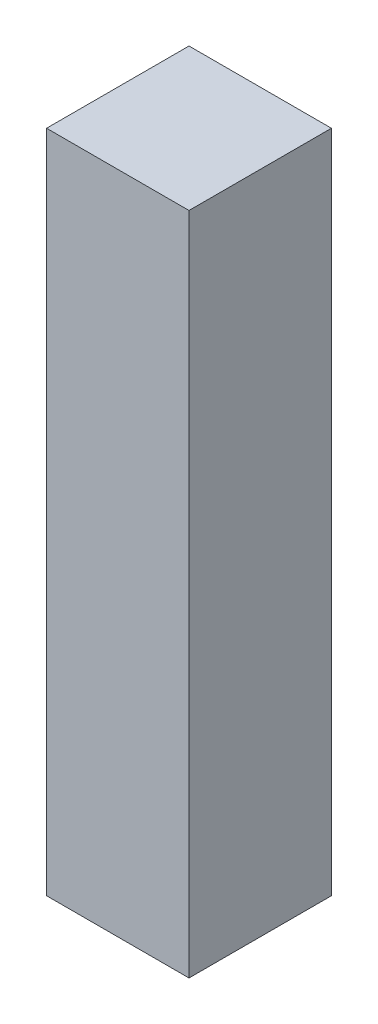
ISO-10303-21;
HEADER;
FILE_DESCRIPTION(('STEP AP214'),'2;1');
FILE_NAME('part.step','',(''),(''),'','','');
FILE_SCHEMA(('AUTOMOTIVE_DESIGN { 1 0 10303 214 1 1 1 1 }'));
ENDSEC;
DATA;
#1=APPLICATION_CONTEXT('core data for automotive mechanical design processes');
#2=APPLICATION_PROTOCOL_DEFINITION('international standard','automotive_design',2000,#1);
#3=PRODUCT_CONTEXT('',#1,'mechanical');
#4=PRODUCT('Part','Part','',(#3));
#5=PRODUCT_RELATED_PRODUCT_CATEGORY('part','',(#4));
#6=PRODUCT_DEFINITION_FORMATION('','',#4);
#7=PRODUCT_DEFINITION_CONTEXT('part definition',#1,'design');
#8=PRODUCT_DEFINITION('design','',#6,#7);
#9=PRODUCT_DEFINITION_SHAPE('','',#8);
#10=(LENGTH_UNIT() NAMED_UNIT(*) SI_UNIT(.MILLI.,.METRE.));
#11=(NAMED_UNIT(*) PLANE_ANGLE_UNIT() SI_UNIT($,.RADIAN.));
#12=(NAMED_UNIT(*) SI_UNIT($,.STERADIAN.) SOLID_ANGLE_UNIT());
#13=UNCERTAINTY_MEASURE_WITH_UNIT(LENGTH_MEASURE(1.E-05),#10,'distance_accuracy_value','');
#14=(GEOMETRIC_REPRESENTATION_CONTEXT(3) GLOBAL_UNCERTAINTY_ASSIGNED_CONTEXT((#13)) GLOBAL_UNIT_ASSIGNED_CONTEXT((#10,
#11,#12)) REPRESENTATION_CONTEXT('',''));
#15=CARTESIAN_POINT('',(0.,0.,0.));
#16=DIRECTION('',(0.,0.,1.));
#17=DIRECTION('',(1.,0.,0.));
#18=AXIS2_PLACEMENT_3D('',#15,#16,#17);
#19=CARTESIAN_POINT('',(3.,28.,3.));
#20=DIRECTION('',(-1.,0.,0.));
#21=DIRECTION('',(0.,0.,1.));
#22=AXIS2_PLACEMENT_3D('',#19,#20,#21);
#23=PLANE('',#22);
#24=DIRECTION('',(0.,0.,-1.));
#25=VECTOR('',#24,1.);
#26=CARTESIAN_POINT('',(3.,0.,3.));
#27=LINE('',#26,#25);
#28=CARTESIAN_POINT('',(3.,0.,3.));
#29=VERTEX_POINT('',#28);
#30=CARTESIAN_POINT('',(3.,0.,-3.));
#31=VERTEX_POINT('',#30);
#32=EDGE_CURVE('E96',#29,#31,#27,.T.);
#33=ORIENTED_EDGE('',*,*,#32,.T.);
#34=DIRECTION('',(0.,-1.,0.));
#35=VECTOR('',#34,1.);
#36=CARTESIAN_POINT('',(3.,28.,-3.));
#37=LINE('',#36,#35);
#38=CARTESIAN_POINT('',(3.,28.,-3.));
#39=VERTEX_POINT('',#38);
#40=EDGE_CURVE('E11',#39,#31,#37,.T.);
#41=ORIENTED_EDGE('',*,*,#40,.F.);
#42=DIRECTION('',(0.,0.,-1.));
#43=VECTOR('',#42,1.);
#44=CARTESIAN_POINT('',(3.,28.,3.));
#45=LINE('',#44,#43);
#46=CARTESIAN_POINT('',(3.,28.,3.));
#47=VERTEX_POINT('',#46);
#48=EDGE_CURVE('E84',#47,#39,#45,.T.);
#49=ORIENTED_EDGE('',*,*,#48,.F.);
#50=DIRECTION('',(0.,-1.,0.));
#51=VECTOR('',#50,1.);
#52=CARTESIAN_POINT('',(3.,28.,3.));
#53=LINE('',#52,#51);
#54=EDGE_CURVE('E92',#47,#29,#53,.T.);
#55=ORIENTED_EDGE('',*,*,#54,.T.);
#56=EDGE_LOOP('',(#33,#41,#49,#55));
#57=FACE_BOUND('',#56,.T.);
#58=ADVANCED_FACE('F33',(#57),#23,.F.);
#59=CARTESIAN_POINT('',(-3.,28.,-3.));
#60=DIRECTION('',(0.,0.,1.));
#61=DIRECTION('',(1.,0.,0.));
#62=AXIS2_PLACEMENT_3D('',#59,#60,#61);
#63=PLANE('',#62);
#64=DIRECTION('',(-1.,0.,0.));
#65=VECTOR('',#64,1.);
#66=CARTESIAN_POINT('',(-3.,0.,-3.));
#67=LINE('',#66,#65);
#68=CARTESIAN_POINT('',(-3.,0.,-3.));
#69=VERTEX_POINT('',#68);
#70=EDGE_CURVE('E88',#31,#69,#67,.T.);
#71=ORIENTED_EDGE('',*,*,#70,.T.);
#72=DIRECTION('',(0.,-1.,0.));
#73=VECTOR('',#72,1.);
#74=CARTESIAN_POINT('',(-3.,28.,-3.));
#75=LINE('',#74,#73);
#76=CARTESIAN_POINT('',(-3.,28.,-3.));
#77=VERTEX_POINT('',#76);
#78=EDGE_CURVE('E41',#77,#69,#75,.T.);
#79=ORIENTED_EDGE('',*,*,#78,.F.);
#80=DIRECTION('',(-1.,0.,0.));
#81=VECTOR('',#80,1.);
#82=CARTESIAN_POINT('',(-3.,28.,-3.));
#83=LINE('',#82,#81);
#84=EDGE_CURVE('E79',#39,#77,#83,.T.);
#85=ORIENTED_EDGE('',*,*,#84,.F.);
#86=ORIENTED_EDGE('',*,*,#40,.T.);
#87=EDGE_LOOP('',(#71,#79,#85,#86));
#88=FACE_BOUND('',#87,.T.);
#89=ADVANCED_FACE('F87',(#88),#63,.F.);
#90=CARTESIAN_POINT('',(-3.,28.,3.));
#91=DIRECTION('',(1.,0.,0.));
#92=DIRECTION('',(0.,0.,-1.));
#93=AXIS2_PLACEMENT_3D('',#90,#91,#92);
#94=PLANE('',#93);
#95=DIRECTION('',(0.,0.,1.));
#96=VECTOR('',#95,1.);
#97=CARTESIAN_POINT('',(-3.,0.,3.));
#98=LINE('',#97,#96);
#99=CARTESIAN_POINT('',(-3.,0.,3.));
#100=VERTEX_POINT('',#99);
#101=EDGE_CURVE('E66',#69,#100,#98,.T.);
#102=ORIENTED_EDGE('',*,*,#101,.T.);
#103=DIRECTION('',(0.,-1.,0.));
#104=VECTOR('',#103,1.);
#105=CARTESIAN_POINT('',(-3.,28.,3.));
#106=LINE('',#105,#104);
#107=CARTESIAN_POINT('',(-3.,28.,3.));
#108=VERTEX_POINT('',#107);
#109=EDGE_CURVE('E89',#108,#100,#106,.T.);
#110=ORIENTED_EDGE('',*,*,#109,.F.);
#111=DIRECTION('',(0.,0.,1.));
#112=VECTOR('',#111,1.);
#113=CARTESIAN_POINT('',(-3.,28.,3.));
#114=LINE('',#113,#112);
#115=EDGE_CURVE('E82',#77,#108,#114,.T.);
#116=ORIENTED_EDGE('',*,*,#115,.F.);
#117=ORIENTED_EDGE('',*,*,#78,.T.);
#118=EDGE_LOOP('',(#102,#110,#116,#117));
#119=FACE_BOUND('',#118,.T.);
#120=ADVANCED_FACE('F90',(#119),#94,.F.);
#121=CARTESIAN_POINT('',(-3.,28.,3.));
#122=DIRECTION('',(0.,0.,-1.));
#123=DIRECTION('',(-1.,0.,0.));
#124=AXIS2_PLACEMENT_3D('',#121,#122,#123);
#125=PLANE('',#124);
#126=DIRECTION('',(1.,0.,0.));
#127=VECTOR('',#126,1.);
#128=CARTESIAN_POINT('',(-3.,0.,3.));
#129=LINE('',#128,#127);
#130=EDGE_CURVE('E72',#100,#29,#129,.T.);
#131=ORIENTED_EDGE('',*,*,#130,.T.);
#132=ORIENTED_EDGE('',*,*,#54,.F.);
#133=DIRECTION('',(1.,0.,0.));
#134=VECTOR('',#133,1.);
#135=CARTESIAN_POINT('',(-3.,28.,3.));
#136=LINE('',#135,#134);
#137=EDGE_CURVE('E49',#108,#47,#136,.T.);
#138=ORIENTED_EDGE('',*,*,#137,.F.);
#139=ORIENTED_EDGE('',*,*,#109,.T.);
#140=EDGE_LOOP('',(#131,#132,#138,#139));
#141=FACE_BOUND('',#140,.T.);
#142=ADVANCED_FACE('F103',(#141),#125,.F.);
#143=CARTESIAN_POINT('',(0.,28.,0.));
#144=DIRECTION('',(0.,-1.,0.));
#145=DIRECTION('',(0.,0.,-1.));
#146=AXIS2_PLACEMENT_3D('',#143,#144,#145);
#147=PLANE('',#146);
#148=ORIENTED_EDGE('',*,*,#48,.T.);
#149=ORIENTED_EDGE('',*,*,#84,.T.);
#150=ORIENTED_EDGE('',*,*,#115,.T.);
#151=ORIENTED_EDGE('',*,*,#137,.T.);
#152=EDGE_LOOP('',(#148,#149,#150,#151));
#153=FACE_BOUND('',#152,.T.);
#154=ADVANCED_FACE('F80',(#153),#147,.F.);
#155=CARTESIAN_POINT('',(0.,0.,0.));
#156=DIRECTION('',(0.,-1.,0.));
#157=DIRECTION('',(0.,0.,-1.));
#158=AXIS2_PLACEMENT_3D('',#155,#156,#157);
#159=PLANE('',#158);
#160=ORIENTED_EDGE('',*,*,#32,.F.);
#161=ORIENTED_EDGE('',*,*,#130,.F.);
#162=ORIENTED_EDGE('',*,*,#101,.F.);
#163=ORIENTED_EDGE('',*,*,#70,.F.);
#164=EDGE_LOOP('',(#160,#161,#162,#163));
#165=FACE_BOUND('',#164,.T.);
#166=ADVANCED_FACE('F106',(#165),#159,.T.);
#167=CLOSED_SHELL('',(#58,#89,#120,#142,#154,#166));
#168=MANIFOLD_SOLID_BREP('B2',#167);
#169=ADVANCED_BREP_SHAPE_REPRESENTATION('',(#18,#168),#14);
#170=SHAPE_DEFINITION_REPRESENTATION(#9,#169);
ENDSEC;
END-ISO-10303-21;
